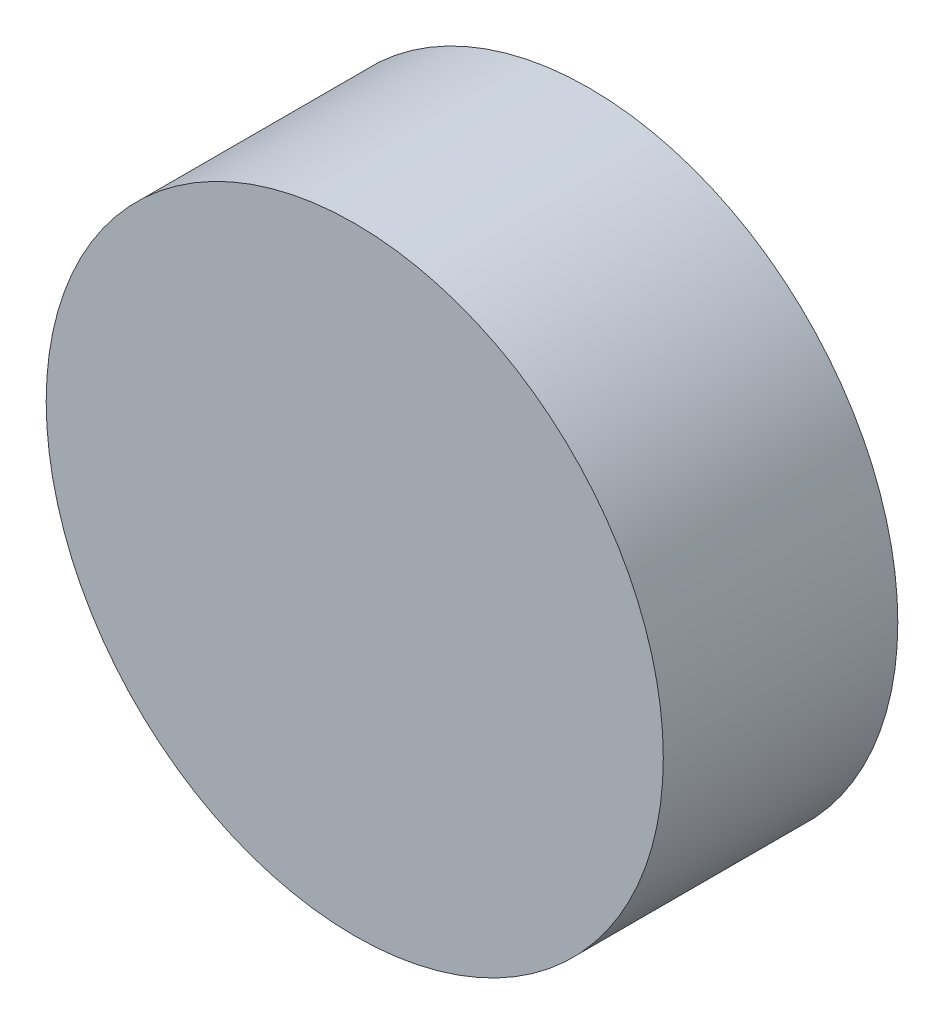
ISO-10303-21;
HEADER;
FILE_DESCRIPTION(('STEP AP214'),'2;1');
FILE_NAME('part.step','',(''),(''),'','','');
FILE_SCHEMA(('AUTOMOTIVE_DESIGN { 1 0 10303 214 1 1 1 1 }'));
ENDSEC;
DATA;
#1=APPLICATION_CONTEXT('core data for automotive mechanical design processes');
#2=APPLICATION_PROTOCOL_DEFINITION('international standard','automotive_design',2000,#1);
#3=PRODUCT_CONTEXT('',#1,'mechanical');
#4=PRODUCT('Part','Part','',(#3));
#5=PRODUCT_RELATED_PRODUCT_CATEGORY('part','',(#4));
#6=PRODUCT_DEFINITION_FORMATION('','',#4);
#7=PRODUCT_DEFINITION_CONTEXT('part definition',#1,'design');
#8=PRODUCT_DEFINITION('design','',#6,#7);
#9=PRODUCT_DEFINITION_SHAPE('','',#8);
#10=(LENGTH_UNIT() NAMED_UNIT(*) SI_UNIT(.MILLI.,.METRE.));
#11=(NAMED_UNIT(*) PLANE_ANGLE_UNIT() SI_UNIT($,.RADIAN.));
#12=(NAMED_UNIT(*) SI_UNIT($,.STERADIAN.) SOLID_ANGLE_UNIT());
#13=UNCERTAINTY_MEASURE_WITH_UNIT(LENGTH_MEASURE(1.E-05),#10,'distance_accuracy_value','');
#14=(GEOMETRIC_REPRESENTATION_CONTEXT(3) GLOBAL_UNCERTAINTY_ASSIGNED_CONTEXT((#13)) GLOBAL_UNIT_ASSIGNED_CONTEXT((#10,
#11,#12)) REPRESENTATION_CONTEXT('',''));
#15=CARTESIAN_POINT('',(0.,0.,0.));
#16=DIRECTION('',(0.,0.,1.));
#17=DIRECTION('',(1.,0.,0.));
#18=AXIS2_PLACEMENT_3D('',#15,#16,#17);
#19=CARTESIAN_POINT('',(0.,0.,0.));
#20=DIRECTION('',(0.,0.,1.));
#21=DIRECTION('',(1.,0.,0.));
#22=AXIS2_PLACEMENT_3D('',#19,#20,#21);
#23=PLANE('',#22);
#24=CARTESIAN_POINT('',(0.,0.,0.));
#25=DIRECTION('',(0.,0.,1.));
#26=DIRECTION('',(1.,0.,0.));
#27=AXIS2_PLACEMENT_3D('',#24,#25,#26);
#28=CIRCLE('',#27,25.);
#29=CARTESIAN_POINT('',(25.,0.,0.));
#30=VERTEX_POINT('',#29);
#31=EDGE_CURVE('E10',#30,#30,#28,.T.);
#32=ORIENTED_EDGE('',*,*,#31,.F.);
#33=EDGE_LOOP('',(#32));
#34=FACE_BOUND('',#33,.T.);
#35=CARTESIAN_POINT('',(0.,0.,0.));
#36=DIRECTION('',(0.,0.,1.));
#37=DIRECTION('',(1.,0.,0.));
#38=AXIS2_PLACEMENT_3D('',#35,#36,#37);
#39=CIRCLE('',#38,12.5);
#40=CARTESIAN_POINT('',(12.5,0.,0.));
#41=VERTEX_POINT('',#40);
#42=EDGE_CURVE('E36',#41,#41,#39,.T.);
#43=ORIENTED_EDGE('',*,*,#42,.T.);
#44=EDGE_LOOP('',(#43));
#45=FACE_BOUND('',#44,.T.);
#46=ADVANCED_FACE('F29',(#34,#45),#23,.F.);
#47=CARTESIAN_POINT('',(0.,0.,15.));
#48=DIRECTION('',(0.,0.,-1.));
#49=DIRECTION('',(-1.,0.,0.));
#50=AXIS2_PLACEMENT_3D('',#47,#48,#49);
#51=CYLINDRICAL_SURFACE('',#50,25.);
#52=ORIENTED_EDGE('',*,*,#31,.T.);
#53=EDGE_LOOP('',(#52));
#54=FACE_BOUND('',#53,.T.);
#55=CARTESIAN_POINT('',(0.,0.,19.));
#56=DIRECTION('',(0.,0.,1.));
#57=DIRECTION('',(1.,0.,0.));
#58=AXIS2_PLACEMENT_3D('',#55,#56,#57);
#59=CIRCLE('',#58,25.);
#60=CARTESIAN_POINT('',(25.,0.,19.));
#61=VERTEX_POINT('',#60);
#62=EDGE_CURVE('E44',#61,#61,#59,.T.);
#63=ORIENTED_EDGE('',*,*,#62,.F.);
#64=EDGE_LOOP('',(#63));
#65=FACE_BOUND('',#64,.T.);
#66=ADVANCED_FACE('F31',(#54,#65),#51,.T.);
#67=CARTESIAN_POINT('',(0.,0.,15.));
#68=DIRECTION('',(0.,0.,-1.));
#69=DIRECTION('',(-1.,0.,0.));
#70=AXIS2_PLACEMENT_3D('',#67,#68,#69);
#71=CYLINDRICAL_SURFACE('',#70,12.5);
#72=CARTESIAN_POINT('',(0.,0.,15.));
#73=DIRECTION('',(0.,0.,1.));
#74=DIRECTION('',(1.,0.,0.));
#75=AXIS2_PLACEMENT_3D('',#72,#73,#74);
#76=CIRCLE('',#75,12.5);
#77=CARTESIAN_POINT('',(12.5,0.,15.));
#78=VERTEX_POINT('',#77);
#79=EDGE_CURVE('E40',#78,#78,#76,.T.);
#80=ORIENTED_EDGE('',*,*,#79,.T.);
#81=EDGE_LOOP('',(#80));
#82=FACE_BOUND('',#81,.T.);
#83=ORIENTED_EDGE('',*,*,#42,.F.);
#84=EDGE_LOOP('',(#83));
#85=FACE_BOUND('',#84,.T.);
#86=ADVANCED_FACE('F53',(#82,#85),#71,.F.);
#87=CARTESIAN_POINT('',(0.,0.,15.));
#88=DIRECTION('',(0.,0.,1.));
#89=DIRECTION('',(1.,0.,0.));
#90=AXIS2_PLACEMENT_3D('',#87,#88,#89);
#91=PLANE('',#90);
#92=ORIENTED_EDGE('',*,*,#79,.F.);
#93=EDGE_LOOP('',(#92));
#94=FACE_BOUND('',#93,.T.);
#95=ADVANCED_FACE('F58',(#94),#91,.F.);
#96=CARTESIAN_POINT('',(0.,0.,19.));
#97=DIRECTION('',(0.,0.,1.));
#98=DIRECTION('',(1.,0.,0.));
#99=AXIS2_PLACEMENT_3D('',#96,#97,#98);
#100=PLANE('',#99);
#101=ORIENTED_EDGE('',*,*,#62,.T.);
#102=EDGE_LOOP('',(#101));
#103=FACE_BOUND('',#102,.T.);
#104=ADVANCED_FACE('F50',(#103),#100,.T.);
#105=CLOSED_SHELL('',(#46,#66,#86,#95,#104));
#106=MANIFOLD_SOLID_BREP('B2',#105);
#107=ADVANCED_BREP_SHAPE_REPRESENTATION('',(#18,#106),#14);
#108=SHAPE_DEFINITION_REPRESENTATION(#9,#107);
ENDSEC;
END-ISO-10303-21;
